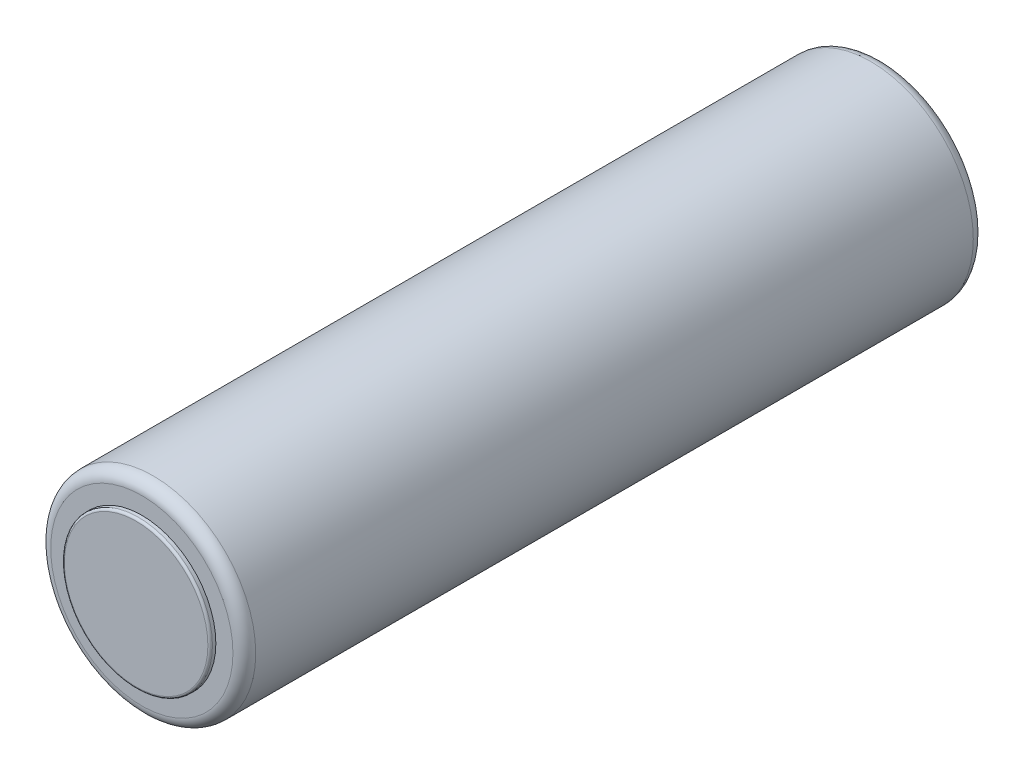
ISO-10303-21;
HEADER;
FILE_DESCRIPTION(('STEP AP214'),'2;1');
FILE_NAME('part.step','',(''),(''),'','','');
FILE_SCHEMA(('AUTOMOTIVE_DESIGN { 1 0 10303 214 1 1 1 1 }'));
ENDSEC;
DATA;
#1=APPLICATION_CONTEXT('core data for automotive mechanical design processes');
#2=APPLICATION_PROTOCOL_DEFINITION('international standard','automotive_design',2000,#1);
#3=PRODUCT_CONTEXT('',#1,'mechanical');
#4=PRODUCT('Part','Part','',(#3));
#5=PRODUCT_RELATED_PRODUCT_CATEGORY('part','',(#4));
#6=PRODUCT_DEFINITION_FORMATION('','',#4);
#7=PRODUCT_DEFINITION_CONTEXT('part definition',#1,'design');
#8=PRODUCT_DEFINITION('design','',#6,#7);
#9=PRODUCT_DEFINITION_SHAPE('','',#8);
#10=(LENGTH_UNIT() NAMED_UNIT(*) SI_UNIT(.MILLI.,.METRE.));
#11=(NAMED_UNIT(*) PLANE_ANGLE_UNIT() SI_UNIT($,.RADIAN.));
#12=(NAMED_UNIT(*) SI_UNIT($,.STERADIAN.) SOLID_ANGLE_UNIT());
#13=UNCERTAINTY_MEASURE_WITH_UNIT(LENGTH_MEASURE(1.E-05),#10,'distance_accuracy_value','');
#14=(GEOMETRIC_REPRESENTATION_CONTEXT(3) GLOBAL_UNCERTAINTY_ASSIGNED_CONTEXT((#13)) GLOBAL_UNIT_ASSIGNED_CONTEXT((#10,
#11,#12)) REPRESENTATION_CONTEXT('',''));
#15=CARTESIAN_POINT('',(0.,0.,0.));
#16=DIRECTION('',(0.,0.,1.));
#17=DIRECTION('',(1.,0.,0.));
#18=AXIS2_PLACEMENT_3D('',#15,#16,#17);
#19=CARTESIAN_POINT('',(0.,0.,65.5));
#20=DIRECTION('',(0.,0.,-1.));
#21=DIRECTION('',(-1.,0.,0.));
#22=AXIS2_PLACEMENT_3D('',#19,#20,#21);
#23=CYLINDRICAL_SURFACE('',#22,6.5);
#24=CARTESIAN_POINT('',(0.,0.,65.3));
#25=DIRECTION('',(0.,0.,1.));
#26=DIRECTION('',(1.,0.,0.));
#27=AXIS2_PLACEMENT_3D('',#24,#25,#26);
#28=CIRCLE('',#27,6.5);
#29=CARTESIAN_POINT('',(6.5,0.,65.3));
#30=VERTEX_POINT('',#29);
#31=EDGE_CURVE('E11',#30,#30,#28,.F.);
#32=ORIENTED_EDGE('',*,*,#31,.T.);
#33=EDGE_LOOP('',(#32));
#34=FACE_BOUND('',#33,.T.);
#35=CARTESIAN_POINT('',(0.,0.,65.));
#36=DIRECTION('',(0.,0.,1.));
#37=DIRECTION('',(1.,0.,0.));
#38=AXIS2_PLACEMENT_3D('',#35,#36,#37);
#39=CIRCLE('',#38,6.5);
#40=CARTESIAN_POINT('',(6.5,0.,65.));
#41=VERTEX_POINT('',#40);
#42=EDGE_CURVE('E53',#41,#41,#39,.T.);
#43=ORIENTED_EDGE('',*,*,#42,.T.);
#44=EDGE_LOOP('',(#43));
#45=FACE_BOUND('',#44,.T.);
#46=ADVANCED_FACE('F42',(#34,#45),#23,.T.);
#47=CARTESIAN_POINT('',(0.,0.,65.5));
#48=DIRECTION('',(0.,0.,1.));
#49=DIRECTION('',(1.,0.,0.));
#50=AXIS2_PLACEMENT_3D('',#47,#48,#49);
#51=PLANE('',#50);
#52=CARTESIAN_POINT('',(0.,0.,65.5));
#53=DIRECTION('',(0.,0.,1.));
#54=DIRECTION('',(1.,0.,0.));
#55=AXIS2_PLACEMENT_3D('',#52,#53,#54);
#56=CIRCLE('',#55,6.3);
#57=CARTESIAN_POINT('',(6.3,0.,65.5));
#58=VERTEX_POINT('',#57);
#59=EDGE_CURVE('E49',#58,#58,#56,.T.);
#60=ORIENTED_EDGE('',*,*,#59,.T.);
#61=EDGE_LOOP('',(#60));
#62=FACE_BOUND('',#61,.T.);
#63=ADVANCED_FACE('F63',(#62),#51,.T.);
#64=CARTESIAN_POINT('',(0.,0.,65.));
#65=DIRECTION('',(0.,0.,1.));
#66=DIRECTION('',(1.,0.,0.));
#67=AXIS2_PLACEMENT_3D('',#64,#65,#66);
#68=PLANE('',#67);
#69=ORIENTED_EDGE('',*,*,#42,.F.);
#70=EDGE_LOOP('',(#69));
#71=FACE_BOUND('',#70,.T.);
#72=ADVANCED_FACE('F61',(#71),#68,.F.);
#73=CARTESIAN_POINT('',(0.,0.,65.3));
#74=DIRECTION('',(0.,0.,1.));
#75=DIRECTION('',(1.,0.,0.));
#76=AXIS2_PLACEMENT_3D('',#73,#74,#75);
#77=TOROIDAL_SURFACE('',#76,6.3,0.2);
#78=ORIENTED_EDGE('',*,*,#31,.F.);
#79=EDGE_LOOP('',(#78));
#80=FACE_BOUND('',#79,.T.);
#81=ORIENTED_EDGE('',*,*,#59,.F.);
#82=EDGE_LOOP('',(#81));
#83=FACE_BOUND('',#82,.T.);
#84=ADVANCED_FACE('F44',(#80,#83),#77,.T.);
#85=CLOSED_SHELL('',(#46,#63,#72,#84));
#86=MANIFOLD_SOLID_BREP('B2',#85);
#87=CARTESIAN_POINT('',(0.,0.,-1.));
#88=DIRECTION('',(0.,0.,1.));
#89=DIRECTION('',(1.,0.,0.));
#90=AXIS2_PLACEMENT_3D('',#87,#88,#89);
#91=CYLINDRICAL_SURFACE('',#90,2.5);
#92=CARTESIAN_POINT('',(0.,0.,-0.8));
#93=DIRECTION('',(0.,0.,-1.));
#94=DIRECTION('',(-1.,0.,0.));
#95=AXIS2_PLACEMENT_3D('',#92,#93,#94);
#96=CIRCLE('',#95,2.5);
#97=CARTESIAN_POINT('',(-2.5,0.,-0.8));
#98=VERTEX_POINT('',#97);
#99=EDGE_CURVE('E41',#98,#98,#96,.F.);
#100=ORIENTED_EDGE('',*,*,#99,.T.);
#101=EDGE_LOOP('',(#100));
#102=FACE_BOUND('',#101,.T.);
#103=CARTESIAN_POINT('',(0.,0.,0.));
#104=DIRECTION('',(0.,0.,-1.));
#105=DIRECTION('',(-1.,0.,0.));
#106=AXIS2_PLACEMENT_3D('',#103,#104,#105);
#107=CIRCLE('',#106,2.5);
#108=CARTESIAN_POINT('',(-2.5,0.,0.));
#109=VERTEX_POINT('',#108);
#110=EDGE_CURVE('E116',#109,#109,#107,.T.);
#111=ORIENTED_EDGE('',*,*,#110,.T.);
#112=EDGE_LOOP('',(#111));
#113=FACE_BOUND('',#112,.T.);
#114=ADVANCED_FACE('F105',(#102,#113),#91,.T.);
#115=CARTESIAN_POINT('',(0.,0.,-1.));
#116=DIRECTION('',(0.,0.,-1.));
#117=DIRECTION('',(-1.,0.,0.));
#118=AXIS2_PLACEMENT_3D('',#115,#116,#117);
#119=PLANE('',#118);
#120=CARTESIAN_POINT('',(0.,0.,-1.));
#121=DIRECTION('',(0.,0.,-1.));
#122=DIRECTION('',(-1.,0.,0.));
#123=AXIS2_PLACEMENT_3D('',#120,#121,#122);
#124=CIRCLE('',#123,2.3);
#125=CARTESIAN_POINT('',(-2.3,0.,-1.));
#126=VERTEX_POINT('',#125);
#127=EDGE_CURVE('E112',#126,#126,#124,.T.);
#128=ORIENTED_EDGE('',*,*,#127,.T.);
#129=EDGE_LOOP('',(#128));
#130=FACE_BOUND('',#129,.T.);
#131=ADVANCED_FACE('F126',(#130),#119,.T.);
#132=CARTESIAN_POINT('',(0.,0.,0.));
#133=DIRECTION('',(0.,0.,-1.));
#134=DIRECTION('',(-1.,0.,0.));
#135=AXIS2_PLACEMENT_3D('',#132,#133,#134);
#136=PLANE('',#135);
#137=ORIENTED_EDGE('',*,*,#110,.F.);
#138=EDGE_LOOP('',(#137));
#139=FACE_BOUND('',#138,.T.);
#140=ADVANCED_FACE('F124',(#139),#136,.F.);
#141=CARTESIAN_POINT('',(0.,0.,-0.8));
#142=DIRECTION('',(0.,0.,-1.));
#143=DIRECTION('',(-1.,0.,0.));
#144=AXIS2_PLACEMENT_3D('',#141,#142,#143);
#145=TOROIDAL_SURFACE('',#144,2.3,0.2);
#146=ORIENTED_EDGE('',*,*,#99,.F.);
#147=EDGE_LOOP('',(#146));
#148=FACE_BOUND('',#147,.T.);
#149=ORIENTED_EDGE('',*,*,#127,.F.);
#150=EDGE_LOOP('',(#149));
#151=FACE_BOUND('',#150,.T.);
#152=ADVANCED_FACE('F107',(#148,#151),#145,.T.);
#153=CLOSED_SHELL('',(#114,#131,#140,#152));
#154=MANIFOLD_SOLID_BREP('B6',#153);
#155=CARTESIAN_POINT('',(0.,0.,65.));
#156=DIRECTION('',(0.,0.,-1.));
#157=DIRECTION('',(-1.,0.,0.));
#158=AXIS2_PLACEMENT_3D('',#155,#156,#157);
#159=CYLINDRICAL_SURFACE('',#158,9.);
#160=CARTESIAN_POINT('',(0.,0.,64.));
#161=DIRECTION('',(0.,0.,1.));
#162=DIRECTION('',(1.,0.,0.));
#163=AXIS2_PLACEMENT_3D('',#160,#161,#162);
#164=CIRCLE('',#163,9.);
#165=CARTESIAN_POINT('',(9.,0.,64.));
#166=VERTEX_POINT('',#165);
#167=EDGE_CURVE('E167',#166,#166,#164,.F.);
#168=ORIENTED_EDGE('',*,*,#167,.T.);
#169=EDGE_LOOP('',(#168));
#170=FACE_BOUND('',#169,.T.);
#171=CARTESIAN_POINT('',(0.,0.,1.));
#172=DIRECTION('',(0.,0.,1.));
#173=DIRECTION('',(1.,0.,0.));
#174=AXIS2_PLACEMENT_3D('',#171,#172,#173);
#175=CIRCLE('',#174,9.);
#176=CARTESIAN_POINT('',(9.,0.,1.));
#177=VERTEX_POINT('',#176);
#178=EDGE_CURVE('E171',#177,#177,#175,.T.);
#179=ORIENTED_EDGE('',*,*,#178,.T.);
#180=EDGE_LOOP('',(#179));
#181=FACE_BOUND('',#180,.T.);
#182=ADVANCED_FACE('F160',(#170,#181),#159,.T.);
#183=CARTESIAN_POINT('',(0.,0.,65.));
#184=DIRECTION('',(0.,0.,1.));
#185=DIRECTION('',(1.,0.,0.));
#186=AXIS2_PLACEMENT_3D('',#183,#184,#185);
#187=PLANE('',#186);
#188=CARTESIAN_POINT('',(0.,0.,65.));
#189=DIRECTION('',(0.,0.,1.));
#190=DIRECTION('',(1.,0.,0.));
#191=AXIS2_PLACEMENT_3D('',#188,#189,#190);
#192=CIRCLE('',#191,8.);
#193=CARTESIAN_POINT('',(8.,0.,65.));
#194=VERTEX_POINT('',#193);
#195=EDGE_CURVE('E175',#194,#194,#192,.T.);
#196=ORIENTED_EDGE('',*,*,#195,.T.);
#197=EDGE_LOOP('',(#196));
#198=FACE_BOUND('',#197,.T.);
#199=ADVANCED_FACE('F181',(#198),#187,.T.);
#200=CARTESIAN_POINT('',(0.,0.,0.));
#201=DIRECTION('',(0.,0.,1.));
#202=DIRECTION('',(1.,0.,0.));
#203=AXIS2_PLACEMENT_3D('',#200,#201,#202);
#204=PLANE('',#203);
#205=CARTESIAN_POINT('',(0.,0.,0.));
#206=DIRECTION('',(0.,0.,1.));
#207=DIRECTION('',(1.,0.,0.));
#208=AXIS2_PLACEMENT_3D('',#205,#206,#207);
#209=CIRCLE('',#208,8.);
#210=CARTESIAN_POINT('',(8.,0.,0.));
#211=VERTEX_POINT('',#210);
#212=EDGE_CURVE('E104',#211,#211,#209,.F.);
#213=ORIENTED_EDGE('',*,*,#212,.T.);
#214=EDGE_LOOP('',(#213));
#215=FACE_BOUND('',#214,.T.);
#216=ADVANCED_FACE('F185',(#215),#204,.F.);
#217=CARTESIAN_POINT('',(0.,0.,64.));
#218=DIRECTION('',(0.,0.,1.));
#219=DIRECTION('',(1.,0.,0.));
#220=AXIS2_PLACEMENT_3D('',#217,#218,#219);
#221=TOROIDAL_SURFACE('',#220,8.,1.);
#222=ORIENTED_EDGE('',*,*,#167,.F.);
#223=EDGE_LOOP('',(#222));
#224=FACE_BOUND('',#223,.T.);
#225=ORIENTED_EDGE('',*,*,#195,.F.);
#226=EDGE_LOOP('',(#225));
#227=FACE_BOUND('',#226,.T.);
#228=ADVANCED_FACE('F183',(#224,#227),#221,.T.);
#229=CARTESIAN_POINT('',(0.,0.,1.));
#230=DIRECTION('',(0.,0.,1.));
#231=DIRECTION('',(1.,0.,0.));
#232=AXIS2_PLACEMENT_3D('',#229,#230,#231);
#233=TOROIDAL_SURFACE('',#232,8.,1.);
#234=ORIENTED_EDGE('',*,*,#212,.F.);
#235=EDGE_LOOP('',(#234));
#236=FACE_BOUND('',#235,.T.);
#237=ORIENTED_EDGE('',*,*,#178,.F.);
#238=EDGE_LOOP('',(#237));
#239=FACE_BOUND('',#238,.T.);
#240=ADVANCED_FACE('F162',(#236,#239),#233,.T.);
#241=CLOSED_SHELL('',(#182,#199,#216,#228,#240));
#242=MANIFOLD_SOLID_BREP('B36',#241);
#243=ADVANCED_BREP_SHAPE_REPRESENTATION('',(#18,#86,#154,#242),#14);
#244=SHAPE_DEFINITION_REPRESENTATION(#9,#243);
ENDSEC;
END-ISO-10303-21;
